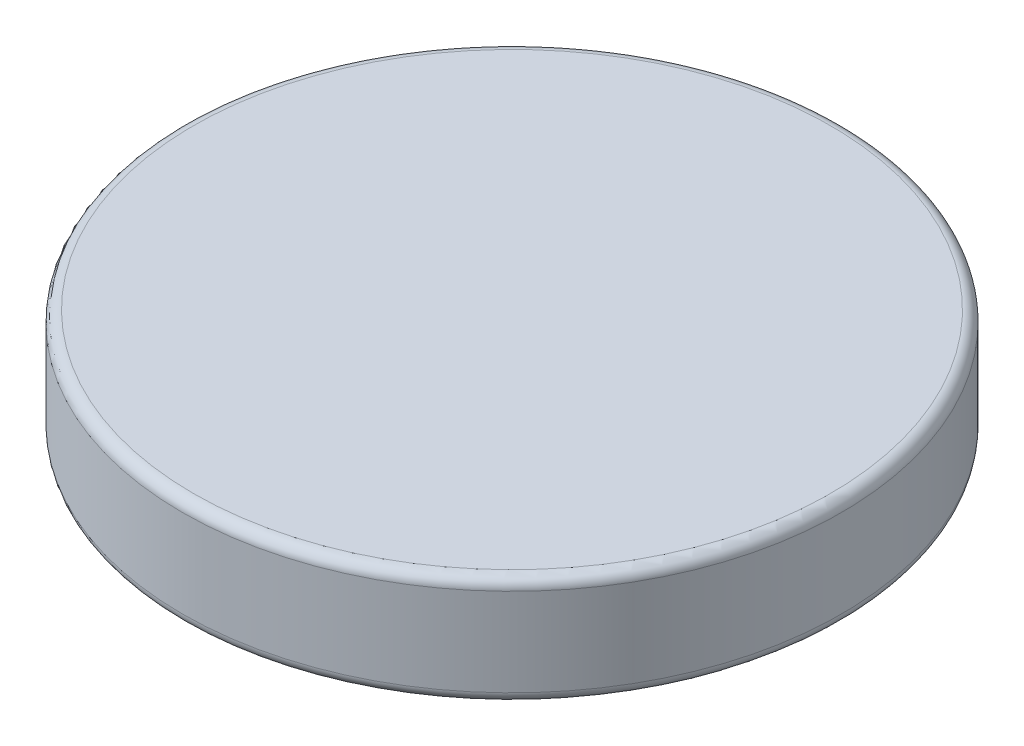
ISO-10303-21;
HEADER;
FILE_DESCRIPTION(('STEP AP214'),'2;1');
FILE_NAME('part.step','',(''),(''),'','','');
FILE_SCHEMA(('AUTOMOTIVE_DESIGN { 1 0 10303 214 1 1 1 1 }'));
ENDSEC;
DATA;
#1=APPLICATION_CONTEXT('core data for automotive mechanical design processes');
#2=APPLICATION_PROTOCOL_DEFINITION('international standard','automotive_design',2000,#1);
#3=PRODUCT_CONTEXT('',#1,'mechanical');
#4=PRODUCT('Part','Part','',(#3));
#5=PRODUCT_RELATED_PRODUCT_CATEGORY('part','',(#4));
#6=PRODUCT_DEFINITION_FORMATION('','',#4);
#7=PRODUCT_DEFINITION_CONTEXT('part definition',#1,'design');
#8=PRODUCT_DEFINITION('design','',#6,#7);
#9=PRODUCT_DEFINITION_SHAPE('','',#8);
#10=(LENGTH_UNIT() NAMED_UNIT(*) SI_UNIT(.MILLI.,.METRE.));
#11=(NAMED_UNIT(*) PLANE_ANGLE_UNIT() SI_UNIT($,.RADIAN.));
#12=(NAMED_UNIT(*) SI_UNIT($,.STERADIAN.) SOLID_ANGLE_UNIT());
#13=UNCERTAINTY_MEASURE_WITH_UNIT(LENGTH_MEASURE(1.E-05),#10,'distance_accuracy_value','');
#14=(GEOMETRIC_REPRESENTATION_CONTEXT(3) GLOBAL_UNCERTAINTY_ASSIGNED_CONTEXT((#13)) GLOBAL_UNIT_ASSIGNED_CONTEXT((#10,
#11,#12)) REPRESENTATION_CONTEXT('',''));
#15=CARTESIAN_POINT('',(0.,0.,0.));
#16=DIRECTION('',(0.,0.,1.));
#17=DIRECTION('',(1.,0.,0.));
#18=AXIS2_PLACEMENT_3D('',#15,#16,#17);
#19=CARTESIAN_POINT('',(0.,2.,0.));
#20=DIRECTION('',(0.,-1.,0.));
#21=DIRECTION('',(0.,0.,-1.));
#22=AXIS2_PLACEMENT_3D('',#19,#20,#21);
#23=CYLINDRICAL_SURFACE('',#22,6.);
#24=CARTESIAN_POINT('',(0.,1.8,0.));
#25=DIRECTION('',(0.,1.,0.));
#26=DIRECTION('',(0.,0.,1.));
#27=AXIS2_PLACEMENT_3D('',#24,#25,#26);
#28=CIRCLE('',#27,6.);
#29=CARTESIAN_POINT('',(0.,1.8,6.));
#30=VERTEX_POINT('',#29);
#31=EDGE_CURVE('E45',#30,#30,#28,.F.);
#32=ORIENTED_EDGE('',*,*,#31,.T.);
#33=EDGE_LOOP('',(#32));
#34=FACE_BOUND('',#33,.T.);
#35=CARTESIAN_POINT('',(0.,0.2,0.));
#36=DIRECTION('',(0.,1.,0.));
#37=DIRECTION('',(0.,0.,1.));
#38=AXIS2_PLACEMENT_3D('',#35,#36,#37);
#39=CIRCLE('',#38,6.);
#40=CARTESIAN_POINT('',(0.,0.2,6.));
#41=VERTEX_POINT('',#40);
#42=EDGE_CURVE('E50',#41,#41,#39,.T.);
#43=ORIENTED_EDGE('',*,*,#42,.T.);
#44=EDGE_LOOP('',(#43));
#45=FACE_BOUND('',#44,.T.);
#46=ADVANCED_FACE('F37',(#34,#45),#23,.T.);
#47=CARTESIAN_POINT('',(0.,2.,0.));
#48=DIRECTION('',(0.,1.,0.));
#49=DIRECTION('',(0.,0.,1.));
#50=AXIS2_PLACEMENT_3D('',#47,#48,#49);
#51=PLANE('',#50);
#52=CARTESIAN_POINT('',(0.,2.,0.));
#53=DIRECTION('',(0.,1.,0.));
#54=DIRECTION('',(0.,0.,1.));
#55=AXIS2_PLACEMENT_3D('',#52,#53,#54);
#56=CIRCLE('',#55,5.8);
#57=CARTESIAN_POINT('',(0.,2.,5.8));
#58=VERTEX_POINT('',#57);
#59=EDGE_CURVE('E55',#58,#58,#56,.T.);
#60=ORIENTED_EDGE('',*,*,#59,.T.);
#61=EDGE_LOOP('',(#60));
#62=FACE_BOUND('',#61,.T.);
#63=ADVANCED_FACE('F62',(#62),#51,.T.);
#64=CARTESIAN_POINT('',(0.,0.,0.));
#65=DIRECTION('',(0.,1.,0.));
#66=DIRECTION('',(0.,0.,1.));
#67=AXIS2_PLACEMENT_3D('',#64,#65,#66);
#68=PLANE('',#67);
#69=CARTESIAN_POINT('',(0.,0.,0.));
#70=DIRECTION('',(0.,1.,0.));
#71=DIRECTION('',(0.,0.,1.));
#72=AXIS2_PLACEMENT_3D('',#69,#70,#71);
#73=CIRCLE('',#72,5.8);
#74=CARTESIAN_POINT('',(0.,0.,5.8));
#75=VERTEX_POINT('',#74);
#76=EDGE_CURVE('E10',#75,#75,#73,.F.);
#77=ORIENTED_EDGE('',*,*,#76,.T.);
#78=EDGE_LOOP('',(#77));
#79=FACE_BOUND('',#78,.T.);
#80=ADVANCED_FACE('F66',(#79),#68,.F.);
#81=CARTESIAN_POINT('',(0.,1.8,0.));
#82=DIRECTION('',(0.,1.,0.));
#83=DIRECTION('',(0.,0.,1.));
#84=AXIS2_PLACEMENT_3D('',#81,#82,#83);
#85=TOROIDAL_SURFACE('',#84,5.8,0.2);
#86=ORIENTED_EDGE('',*,*,#31,.F.);
#87=EDGE_LOOP('',(#86));
#88=FACE_BOUND('',#87,.T.);
#89=ORIENTED_EDGE('',*,*,#59,.F.);
#90=EDGE_LOOP('',(#89));
#91=FACE_BOUND('',#90,.T.);
#92=ADVANCED_FACE('F64',(#88,#91),#85,.T.);
#93=CARTESIAN_POINT('',(0.,0.2,0.));
#94=DIRECTION('',(0.,1.,0.));
#95=DIRECTION('',(0.,0.,1.));
#96=AXIS2_PLACEMENT_3D('',#93,#94,#95);
#97=TOROIDAL_SURFACE('',#96,5.8,0.2);
#98=ORIENTED_EDGE('',*,*,#76,.F.);
#99=EDGE_LOOP('',(#98));
#100=FACE_BOUND('',#99,.T.);
#101=ORIENTED_EDGE('',*,*,#42,.F.);
#102=EDGE_LOOP('',(#101));
#103=FACE_BOUND('',#102,.T.);
#104=ADVANCED_FACE('F39',(#100,#103),#97,.T.);
#105=CLOSED_SHELL('',(#46,#63,#80,#92,#104));
#106=MANIFOLD_SOLID_BREP('B2',#105);
#107=ADVANCED_BREP_SHAPE_REPRESENTATION('',(#18,#106),#14);
#108=SHAPE_DEFINITION_REPRESENTATION(#9,#107);
ENDSEC;
END-ISO-10303-21;
